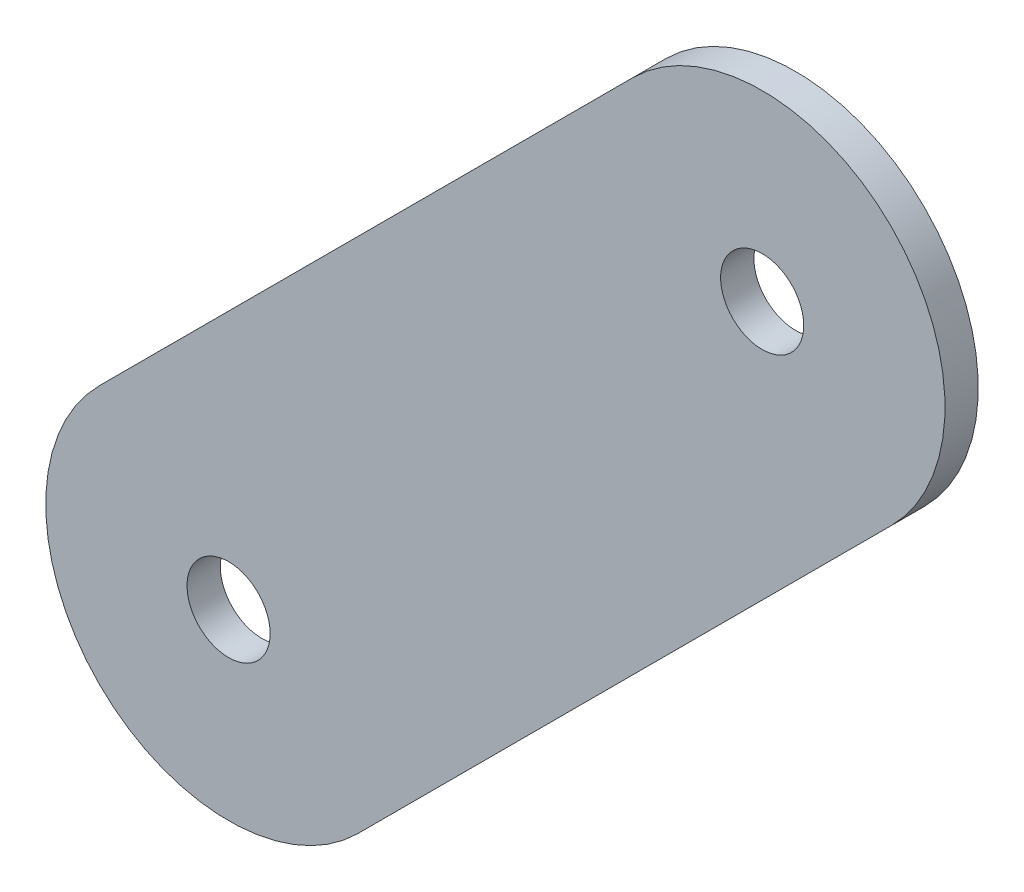
ISO-10303-21;
HEADER;
FILE_DESCRIPTION(('STEP AP214'),'2;1');
FILE_NAME('part.step','',(''),(''),'','','');
FILE_SCHEMA(('AUTOMOTIVE_DESIGN { 1 0 10303 214 1 1 1 1 }'));
ENDSEC;
DATA;
#1=APPLICATION_CONTEXT('core data for automotive mechanical design processes');
#2=APPLICATION_PROTOCOL_DEFINITION('international standard','automotive_design',2000,#1);
#3=PRODUCT_CONTEXT('',#1,'mechanical');
#4=PRODUCT('Part','Part','',(#3));
#5=PRODUCT_RELATED_PRODUCT_CATEGORY('part','',(#4));
#6=PRODUCT_DEFINITION_FORMATION('','',#4);
#7=PRODUCT_DEFINITION_CONTEXT('part definition',#1,'design');
#8=PRODUCT_DEFINITION('design','',#6,#7);
#9=PRODUCT_DEFINITION_SHAPE('','',#8);
#10=(LENGTH_UNIT() NAMED_UNIT(*) SI_UNIT(.MILLI.,.METRE.));
#11=(NAMED_UNIT(*) PLANE_ANGLE_UNIT() SI_UNIT($,.RADIAN.));
#12=(NAMED_UNIT(*) SI_UNIT($,.STERADIAN.) SOLID_ANGLE_UNIT());
#13=UNCERTAINTY_MEASURE_WITH_UNIT(LENGTH_MEASURE(1.E-05),#10,'distance_accuracy_value','');
#14=(GEOMETRIC_REPRESENTATION_CONTEXT(3) GLOBAL_UNCERTAINTY_ASSIGNED_CONTEXT((#13)) GLOBAL_UNIT_ASSIGNED_CONTEXT((#10,
#11,#12)) REPRESENTATION_CONTEXT('',''));
#15=CARTESIAN_POINT('',(0.,0.,0.));
#16=DIRECTION('',(0.,0.,1.));
#17=DIRECTION('',(1.,0.,0.));
#18=AXIS2_PLACEMENT_3D('',#15,#16,#17);
#19=CARTESIAN_POINT('',(-183.91870837144,16.3418038706977,167.4));
#20=DIRECTION('',(0.,0.,-1.));
#21=DIRECTION('',(-1.,0.,0.));
#22=AXIS2_PLACEMENT_3D('',#19,#20,#21);
#23=CYLINDRICAL_SURFACE('',#22,11.);
#24=CARTESIAN_POINT('',(-183.91870837144,16.3418038706977,165.4));
#25=DIRECTION('',(0.,0.,1.));
#26=DIRECTION('',(1.,0.,0.));
#27=AXIS2_PLACEMENT_3D('',#24,#25,#26);
#28=CIRCLE('',#27,11.);
#29=CARTESIAN_POINT('',(-176.140533778388,8.56362927764567,165.4));
#30=VERTEX_POINT('',#29);
#31=CARTESIAN_POINT('',(-191.696882964492,24.1199784637497,165.4));
#32=VERTEX_POINT('',#31);
#33=EDGE_CURVE('E104',#30,#32,#28,.T.);
#34=ORIENTED_EDGE('',*,*,#33,.T.);
#35=DIRECTION('',(0.,0.,-1.));
#36=VECTOR('',#35,1.);
#37=CARTESIAN_POINT('',(-191.696882964492,24.1199784637497,167.4));
#38=LINE('',#37,#36);
#39=CARTESIAN_POINT('',(-191.696882964492,24.1199784637497,167.4));
#40=VERTEX_POINT('',#39);
#41=EDGE_CURVE('E11',#40,#32,#38,.T.);
#42=ORIENTED_EDGE('',*,*,#41,.F.);
#43=CARTESIAN_POINT('',(-183.91870837144,16.3418038706977,167.4));
#44=DIRECTION('',(0.,0.,1.));
#45=DIRECTION('',(1.,0.,0.));
#46=AXIS2_PLACEMENT_3D('',#43,#44,#45);
#47=CIRCLE('',#46,11.);
#48=CARTESIAN_POINT('',(-176.140533778388,8.56362927764567,167.4));
#49=VERTEX_POINT('',#48);
#50=EDGE_CURVE('E81',#49,#40,#47,.T.);
#51=ORIENTED_EDGE('',*,*,#50,.F.);
#52=DIRECTION('',(0.,0.,-1.));
#53=VECTOR('',#52,1.);
#54=CARTESIAN_POINT('',(-176.140533778388,8.56362927764567,167.4));
#55=LINE('',#54,#53);
#56=EDGE_CURVE('E103',#49,#30,#55,.T.);
#57=ORIENTED_EDGE('',*,*,#56,.T.);
#58=EDGE_LOOP('',(#34,#42,#51,#57));
#59=FACE_BOUND('',#58,.T.);
#60=ADVANCED_FACE('F37',(#59),#23,.T.);
#61=CARTESIAN_POINT('',(-107.908430714121,107.908430714121,167.4));
#62=DIRECTION('',(-0.707106781186548,0.707106781186547,0.));
#63=DIRECTION('',(-0.707106781186547,-0.707106781186548,0.));
#64=AXIS2_PLACEMENT_3D('',#61,#62,#63);
#65=PLANE('',#64);
#66=DIRECTION('',(0.707106781186547,0.707106781186548,0.));
#67=VECTOR('',#66,1.);
#68=CARTESIAN_POINT('',(-107.908430714121,107.908430714121,165.4));
#69=LINE('',#68,#67);
#70=CARTESIAN_POINT('',(-223.799530830361,-7.9826694021192,165.4));
#71=VERTEX_POINT('',#70);
#72=EDGE_CURVE('E91',#71,#32,#69,.T.);
#73=ORIENTED_EDGE('',*,*,#72,.F.);
#74=DIRECTION('',(0.,0.,-1.));
#75=VECTOR('',#74,1.);
#76=CARTESIAN_POINT('',(-223.799530830361,-7.9826694021192,167.4));
#77=LINE('',#76,#75);
#78=CARTESIAN_POINT('',(-223.799530830361,-7.9826694021192,167.4));
#79=VERTEX_POINT('',#78);
#80=EDGE_CURVE('E46',#79,#71,#77,.T.);
#81=ORIENTED_EDGE('',*,*,#80,.F.);
#82=DIRECTION('',(0.707106781186547,0.707106781186548,0.));
#83=VECTOR('',#82,1.);
#84=CARTESIAN_POINT('',(-107.908430714121,107.908430714121,167.4));
#85=LINE('',#84,#83);
#86=EDGE_CURVE('E89',#79,#40,#85,.T.);
#87=ORIENTED_EDGE('',*,*,#86,.T.);
#88=ORIENTED_EDGE('',*,*,#41,.T.);
#89=EDGE_LOOP('',(#73,#81,#87,#88));
#90=FACE_BOUND('',#89,.T.);
#91=ADVANCED_FACE('F88',(#90),#65,.T.);
#92=CARTESIAN_POINT('',(-216.021356237309,-15.7608439951712,167.4));
#93=DIRECTION('',(0.,0.,-1.));
#94=DIRECTION('',(-1.,0.,0.));
#95=AXIS2_PLACEMENT_3D('',#92,#93,#94);
#96=CYLINDRICAL_SURFACE('',#95,11.);
#97=CARTESIAN_POINT('',(-216.021356237309,-15.7608439951712,165.4));
#98=DIRECTION('',(0.,0.,1.));
#99=DIRECTION('',(1.,0.,0.));
#100=AXIS2_PLACEMENT_3D('',#97,#98,#99);
#101=CIRCLE('',#100,11.);
#102=CARTESIAN_POINT('',(-208.243181644257,-23.5390185882233,165.4));
#103=VERTEX_POINT('',#102);
#104=EDGE_CURVE('E70',#71,#103,#101,.T.);
#105=ORIENTED_EDGE('',*,*,#104,.T.);
#106=DIRECTION('',(0.,0.,-1.));
#107=VECTOR('',#106,1.);
#108=CARTESIAN_POINT('',(-208.243181644257,-23.5390185882233,167.4));
#109=LINE('',#108,#107);
#110=CARTESIAN_POINT('',(-208.243181644257,-23.5390185882233,167.4));
#111=VERTEX_POINT('',#110);
#112=EDGE_CURVE('E92',#111,#103,#109,.T.);
#113=ORIENTED_EDGE('',*,*,#112,.F.);
#114=CARTESIAN_POINT('',(-216.021356237309,-15.7608439951712,167.4));
#115=DIRECTION('',(0.,0.,1.));
#116=DIRECTION('',(1.,0.,0.));
#117=AXIS2_PLACEMENT_3D('',#114,#115,#116);
#118=CIRCLE('',#117,11.);
#119=EDGE_CURVE('E94',#79,#111,#118,.T.);
#120=ORIENTED_EDGE('',*,*,#119,.F.);
#121=ORIENTED_EDGE('',*,*,#80,.T.);
#122=EDGE_LOOP('',(#105,#113,#120,#121));
#123=FACE_BOUND('',#122,.T.);
#124=ADVANCED_FACE('F95',(#123),#96,.T.);
#125=CARTESIAN_POINT('',(-92.352081528017,92.352081528017,167.4));
#126=DIRECTION('',(-0.707106781186548,0.707106781186547,0.));
#127=DIRECTION('',(-0.707106781186547,-0.707106781186548,0.));
#128=AXIS2_PLACEMENT_3D('',#125,#126,#127);
#129=PLANE('',#128);
#130=DIRECTION('',(0.707106781186547,0.707106781186548,0.));
#131=VECTOR('',#130,1.);
#132=CARTESIAN_POINT('',(-92.352081528017,92.352081528017,165.4));
#133=LINE('',#132,#131);
#134=EDGE_CURVE('E76',#103,#30,#133,.T.);
#135=ORIENTED_EDGE('',*,*,#134,.T.);
#136=ORIENTED_EDGE('',*,*,#56,.F.);
#137=DIRECTION('',(0.707106781186547,0.707106781186548,0.));
#138=VECTOR('',#137,1.);
#139=CARTESIAN_POINT('',(-92.352081528017,92.352081528017,167.4));
#140=LINE('',#139,#138);
#141=EDGE_CURVE('E55',#111,#49,#140,.T.);
#142=ORIENTED_EDGE('',*,*,#141,.F.);
#143=ORIENTED_EDGE('',*,*,#112,.T.);
#144=EDGE_LOOP('',(#135,#136,#142,#143));
#145=FACE_BOUND('',#144,.T.);
#146=ADVANCED_FACE('F130',(#145),#129,.F.);
#147=CARTESIAN_POINT('',(0.,0.,167.4));
#148=DIRECTION('',(0.,0.,1.));
#149=DIRECTION('',(1.,0.,0.));
#150=AXIS2_PLACEMENT_3D('',#147,#148,#149);
#151=PLANE('',#150);
#152=CARTESIAN_POINT('',(-183.91870837144,16.3418038706977,167.4));
#153=DIRECTION('',(0.,0.,1.));
#154=DIRECTION('',(1.,0.,0.));
#155=AXIS2_PLACEMENT_3D('',#152,#153,#154);
#156=CIRCLE('',#155,2.5);
#157=CARTESIAN_POINT('',(-181.41870837144,16.3418038706977,167.4));
#158=VERTEX_POINT('',#157);
#159=EDGE_CURVE('E113',#158,#158,#156,.T.);
#160=ORIENTED_EDGE('',*,*,#159,.F.);
#161=EDGE_LOOP('',(#160));
#162=FACE_BOUND('',#161,.T.);
#163=CARTESIAN_POINT('',(-216.02135623731,-15.7608439951716,167.4));
#164=DIRECTION('',(0.,0.,1.));
#165=DIRECTION('',(1.,0.,0.));
#166=AXIS2_PLACEMENT_3D('',#163,#164,#165);
#167=CIRCLE('',#166,2.5);
#168=CARTESIAN_POINT('',(-213.52135623731,-15.7608439951716,167.4));
#169=VERTEX_POINT('',#168);
#170=EDGE_CURVE('E118',#169,#169,#167,.T.);
#171=ORIENTED_EDGE('',*,*,#170,.F.);
#172=EDGE_LOOP('',(#171));
#173=FACE_BOUND('',#172,.T.);
#174=ORIENTED_EDGE('',*,*,#50,.T.);
#175=ORIENTED_EDGE('',*,*,#86,.F.);
#176=ORIENTED_EDGE('',*,*,#119,.T.);
#177=ORIENTED_EDGE('',*,*,#141,.T.);
#178=EDGE_LOOP('',(#174,#175,#176,#177));
#179=FACE_BOUND('',#178,.T.);
#180=ADVANCED_FACE('F97',(#162,#173,#179),#151,.T.);
#181=CARTESIAN_POINT('',(0.,0.,165.4));
#182=DIRECTION('',(0.,0.,1.));
#183=DIRECTION('',(1.,0.,0.));
#184=AXIS2_PLACEMENT_3D('',#181,#182,#183);
#185=PLANE('',#184);
#186=CARTESIAN_POINT('',(-183.91870837144,16.3418038706977,165.4));
#187=DIRECTION('',(0.,0.,1.));
#188=DIRECTION('',(1.,0.,0.));
#189=AXIS2_PLACEMENT_3D('',#186,#187,#188);
#190=CIRCLE('',#189,2.5);
#191=CARTESIAN_POINT('',(-181.41870837144,16.3418038706977,165.4));
#192=VERTEX_POINT('',#191);
#193=EDGE_CURVE('E40',#192,#192,#190,.T.);
#194=ORIENTED_EDGE('',*,*,#193,.T.);
#195=EDGE_LOOP('',(#194));
#196=FACE_BOUND('',#195,.T.);
#197=CARTESIAN_POINT('',(-216.02135623731,-15.7608439951716,165.4));
#198=DIRECTION('',(0.,0.,1.));
#199=DIRECTION('',(1.,0.,0.));
#200=AXIS2_PLACEMENT_3D('',#197,#198,#199);
#201=CIRCLE('',#200,2.5);
#202=CARTESIAN_POINT('',(-213.52135623731,-15.7608439951716,165.4));
#203=VERTEX_POINT('',#202);
#204=EDGE_CURVE('E111',#203,#203,#201,.T.);
#205=ORIENTED_EDGE('',*,*,#204,.T.);
#206=EDGE_LOOP('',(#205));
#207=FACE_BOUND('',#206,.T.);
#208=ORIENTED_EDGE('',*,*,#33,.F.);
#209=ORIENTED_EDGE('',*,*,#134,.F.);
#210=ORIENTED_EDGE('',*,*,#104,.F.);
#211=ORIENTED_EDGE('',*,*,#72,.T.);
#212=EDGE_LOOP('',(#208,#209,#210,#211));
#213=FACE_BOUND('',#212,.T.);
#214=ADVANCED_FACE('F129',(#196,#207,#213),#185,.F.);
#215=CARTESIAN_POINT('',(-216.02135623731,-15.7608439951716,138.));
#216=DIRECTION('',(0.,0.,1.));
#217=DIRECTION('',(1.,0.,0.));
#218=AXIS2_PLACEMENT_3D('',#215,#216,#217);
#219=CYLINDRICAL_SURFACE('',#218,2.5);
#220=ORIENTED_EDGE('',*,*,#170,.T.);
#221=EDGE_LOOP('',(#220));
#222=FACE_BOUND('',#221,.T.);
#223=ORIENTED_EDGE('',*,*,#204,.F.);
#224=EDGE_LOOP('',(#223));
#225=FACE_BOUND('',#224,.T.);
#226=ADVANCED_FACE('F125',(#222,#225),#219,.F.);
#227=CARTESIAN_POINT('',(-183.91870837144,16.3418038706977,138.));
#228=DIRECTION('',(0.,0.,1.));
#229=DIRECTION('',(1.,0.,0.));
#230=AXIS2_PLACEMENT_3D('',#227,#228,#229);
#231=CYLINDRICAL_SURFACE('',#230,2.5);
#232=ORIENTED_EDGE('',*,*,#159,.T.);
#233=EDGE_LOOP('',(#232));
#234=FACE_BOUND('',#233,.T.);
#235=ORIENTED_EDGE('',*,*,#193,.F.);
#236=EDGE_LOOP('',(#235));
#237=FACE_BOUND('',#236,.T.);
#238=ADVANCED_FACE('F246',(#234,#237),#231,.F.);
#239=CLOSED_SHELL('',(#60,#91,#124,#146,#180,#214,#226,#238));
#240=MANIFOLD_SOLID_BREP('B2',#239);
#241=ADVANCED_BREP_SHAPE_REPRESENTATION('',(#18,#240),#14);
#242=SHAPE_DEFINITION_REPRESENTATION(#9,#241);
ENDSEC;
END-ISO-10303-21;
